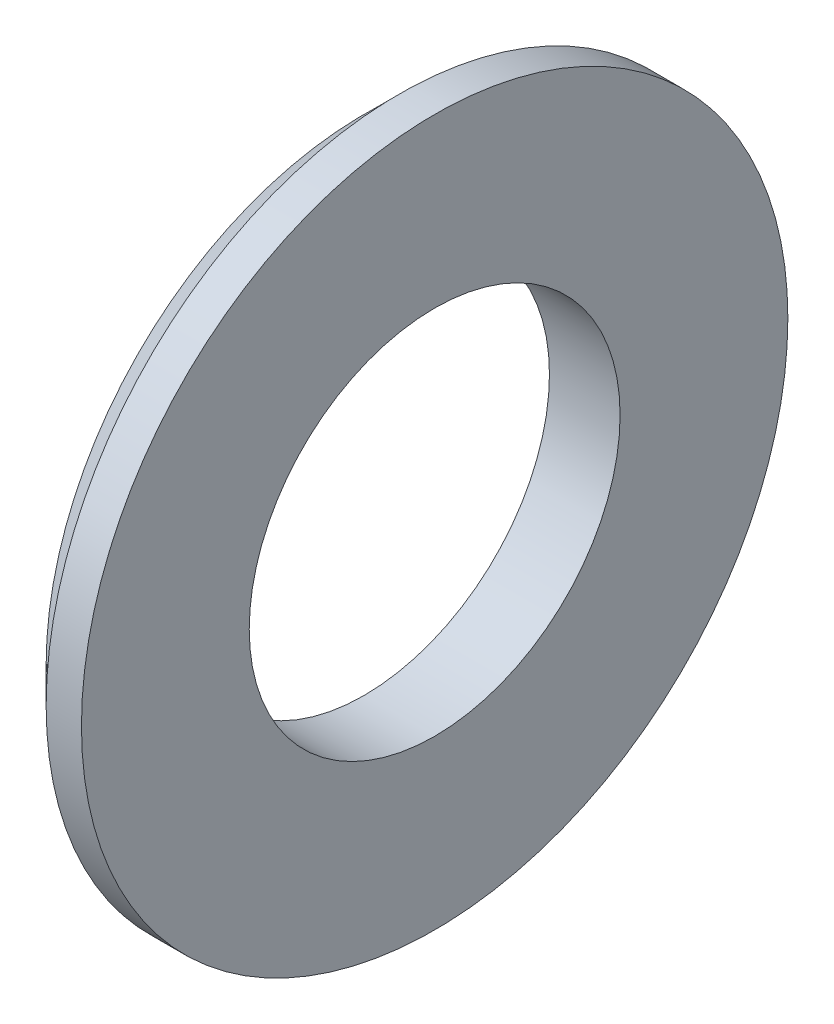
ISO-10303-21;
HEADER;
FILE_DESCRIPTION(('STEP AP214'),'2;1');
FILE_NAME('part.step','',(''),(''),'','','');
FILE_SCHEMA(('AUTOMOTIVE_DESIGN { 1 0 10303 214 1 1 1 1 }'));
ENDSEC;
DATA;
#1=APPLICATION_CONTEXT('core data for automotive mechanical design processes');
#2=APPLICATION_PROTOCOL_DEFINITION('international standard','automotive_design',2000,#1);
#3=PRODUCT_CONTEXT('',#1,'mechanical');
#4=PRODUCT('Part','Part','',(#3));
#5=PRODUCT_RELATED_PRODUCT_CATEGORY('part','',(#4));
#6=PRODUCT_DEFINITION_FORMATION('','',#4);
#7=PRODUCT_DEFINITION_CONTEXT('part definition',#1,'design');
#8=PRODUCT_DEFINITION('design','',#6,#7);
#9=PRODUCT_DEFINITION_SHAPE('','',#8);
#10=(LENGTH_UNIT() NAMED_UNIT(*) SI_UNIT(.MILLI.,.METRE.));
#11=(NAMED_UNIT(*) PLANE_ANGLE_UNIT() SI_UNIT($,.RADIAN.));
#12=(NAMED_UNIT(*) SI_UNIT($,.STERADIAN.) SOLID_ANGLE_UNIT());
#13=UNCERTAINTY_MEASURE_WITH_UNIT(LENGTH_MEASURE(1.E-05),#10,'distance_accuracy_value','');
#14=(GEOMETRIC_REPRESENTATION_CONTEXT(3) GLOBAL_UNCERTAINTY_ASSIGNED_CONTEXT((#13)) GLOBAL_UNIT_ASSIGNED_CONTEXT((#10,
#11,#12)) REPRESENTATION_CONTEXT('',''));
#15=CARTESIAN_POINT('',(0.,0.,0.));
#16=DIRECTION('',(0.,0.,1.));
#17=DIRECTION('',(1.,0.,0.));
#18=AXIS2_PLACEMENT_3D('',#15,#16,#17);
#19=CARTESIAN_POINT('',(-34.9249999999999,0.,0.));
#20=DIRECTION('',(-1.,0.,0.));
#21=DIRECTION('',(0.,0.,1.));
#22=AXIS2_PLACEMENT_3D('',#19,#20,#21);
#23=CYLINDRICAL_SURFACE('',#22,5.25);
#24=CARTESIAN_POINT('',(0.,0.,0.));
#25=DIRECTION('',(-1.,0.,0.));
#26=DIRECTION('',(0.,0.,1.));
#27=AXIS2_PLACEMENT_3D('',#24,#25,#26);
#28=CIRCLE('',#27,5.25);
#29=CARTESIAN_POINT('',(0.,0.,5.25));
#30=VERTEX_POINT('',#29);
#31=EDGE_CURVE('E10',#30,#30,#28,.T.);
#32=ORIENTED_EDGE('',*,*,#31,.F.);
#33=EDGE_LOOP('',(#32));
#34=FACE_BOUND('',#33,.T.);
#35=CARTESIAN_POINT('',(-2.,0.,0.));
#36=DIRECTION('',(-1.,0.,0.));
#37=DIRECTION('',(0.,0.,1.));
#38=AXIS2_PLACEMENT_3D('',#35,#36,#37);
#39=CIRCLE('',#38,5.25);
#40=CARTESIAN_POINT('',(-2.,0.,5.25));
#41=VERTEX_POINT('',#40);
#42=EDGE_CURVE('E51',#41,#41,#39,.T.);
#43=ORIENTED_EDGE('',*,*,#42,.T.);
#44=EDGE_LOOP('',(#43));
#45=FACE_BOUND('',#44,.T.);
#46=ADVANCED_FACE('F32',(#34,#45),#23,.F.);
#47=CARTESIAN_POINT('',(0.,5.25,0.));
#48=DIRECTION('',(-1.,0.,0.));
#49=DIRECTION('',(0.,0.,1.));
#50=AXIS2_PLACEMENT_3D('',#47,#48,#49);
#51=PLANE('',#50);
#52=CARTESIAN_POINT('',(0.,0.,0.));
#53=DIRECTION('',(-1.,0.,0.));
#54=DIRECTION('',(0.,0.,1.));
#55=AXIS2_PLACEMENT_3D('',#52,#53,#54);
#56=CIRCLE('',#55,10.);
#57=CARTESIAN_POINT('',(0.,0.,10.));
#58=VERTEX_POINT('',#57);
#59=EDGE_CURVE('E38',#58,#58,#56,.T.);
#60=ORIENTED_EDGE('',*,*,#59,.F.);
#61=EDGE_LOOP('',(#60));
#62=FACE_BOUND('',#61,.T.);
#63=ORIENTED_EDGE('',*,*,#31,.T.);
#64=EDGE_LOOP('',(#63));
#65=FACE_BOUND('',#64,.T.);
#66=ADVANCED_FACE('F70',(#62,#65),#51,.F.);
#67=CARTESIAN_POINT('',(-34.9249999999999,0.,0.));
#68=DIRECTION('',(-1.,0.,0.));
#69=DIRECTION('',(0.,0.,1.));
#70=AXIS2_PLACEMENT_3D('',#67,#68,#69);
#71=CYLINDRICAL_SURFACE('',#70,10.);
#72=CARTESIAN_POINT('',(-1.,0.,0.));
#73=DIRECTION('',(-1.,0.,0.));
#74=DIRECTION('',(0.,0.,1.));
#75=AXIS2_PLACEMENT_3D('',#72,#73,#74);
#76=CIRCLE('',#75,10.);
#77=CARTESIAN_POINT('',(-1.,0.,10.));
#78=VERTEX_POINT('',#77);
#79=EDGE_CURVE('E42',#78,#78,#76,.T.);
#80=ORIENTED_EDGE('',*,*,#79,.F.);
#81=EDGE_LOOP('',(#80));
#82=FACE_BOUND('',#81,.T.);
#83=ORIENTED_EDGE('',*,*,#59,.T.);
#84=EDGE_LOOP('',(#83));
#85=FACE_BOUND('',#84,.T.);
#86=ADVANCED_FACE('F64',(#82,#85),#71,.T.);
#87=CARTESIAN_POINT('',(-2.,0.,0.));
#88=DIRECTION('',(1.,0.,0.));
#89=DIRECTION('',(0.,0.,-1.));
#90=AXIS2_PLACEMENT_3D('',#87,#88,#89);
#91=CONICAL_SURFACE('',#90,8.99999999999999,0.785398163397453);
#92=ORIENTED_EDGE('',*,*,#79,.T.);
#93=EDGE_LOOP('',(#92));
#94=FACE_BOUND('',#93,.T.);
#95=CARTESIAN_POINT('',(-2.,0.,0.));
#96=DIRECTION('',(-1.,0.,0.));
#97=DIRECTION('',(0.,0.,1.));
#98=AXIS2_PLACEMENT_3D('',#95,#96,#97);
#99=CIRCLE('',#98,8.99999999999999);
#100=CARTESIAN_POINT('',(-2.,0.,8.99999999999999));
#101=VERTEX_POINT('',#100);
#102=EDGE_CURVE('E46',#101,#101,#99,.T.);
#103=ORIENTED_EDGE('',*,*,#102,.F.);
#104=EDGE_LOOP('',(#103));
#105=FACE_BOUND('',#104,.T.);
#106=ADVANCED_FACE('F59',(#94,#105),#91,.T.);
#107=CARTESIAN_POINT('',(-2.,8.99999999999999,0.));
#108=DIRECTION('',(1.,0.,0.));
#109=DIRECTION('',(0.,0.,-1.));
#110=AXIS2_PLACEMENT_3D('',#107,#108,#109);
#111=PLANE('',#110);
#112=ORIENTED_EDGE('',*,*,#42,.F.);
#113=EDGE_LOOP('',(#112));
#114=FACE_BOUND('',#113,.T.);
#115=ORIENTED_EDGE('',*,*,#102,.T.);
#116=EDGE_LOOP('',(#115));
#117=FACE_BOUND('',#116,.T.);
#118=ADVANCED_FACE('F56',(#114,#117),#111,.F.);
#119=CLOSED_SHELL('',(#46,#66,#86,#106,#118));
#120=MANIFOLD_SOLID_BREP('B2',#119);
#121=ADVANCED_BREP_SHAPE_REPRESENTATION('',(#18,#120),#14);
#122=SHAPE_DEFINITION_REPRESENTATION(#9,#121);
ENDSEC;
END-ISO-10303-21;
